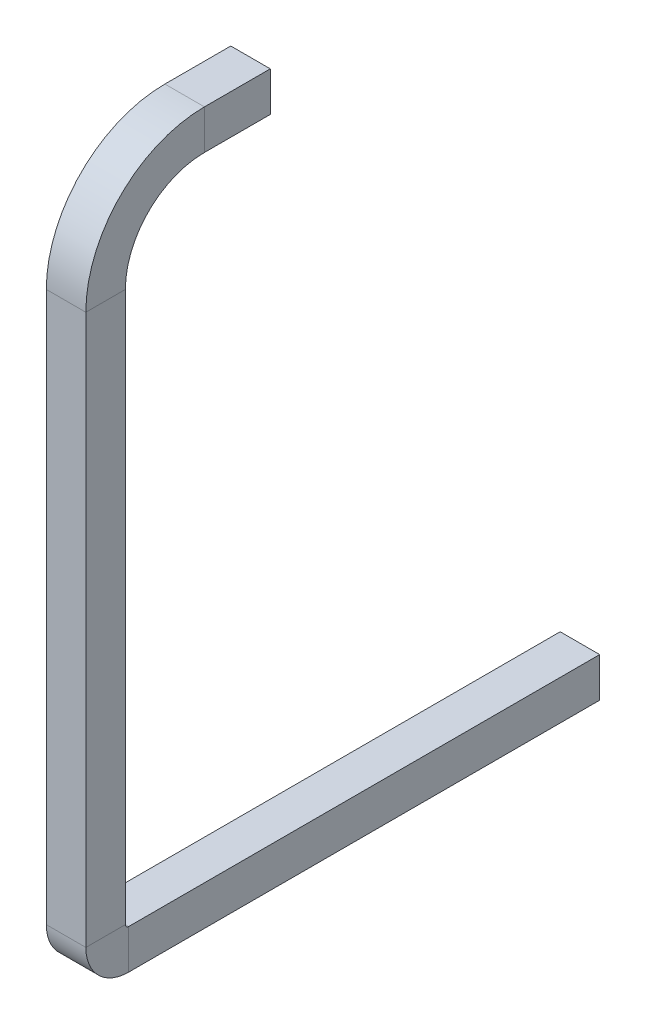
ISO-10303-21;
HEADER;
FILE_DESCRIPTION(('STEP AP214'),'2;1');
FILE_NAME('part.step','',(''),(''),'','','');
FILE_SCHEMA(('AUTOMOTIVE_DESIGN { 1 0 10303 214 1 1 1 1 }'));
ENDSEC;
DATA;
#1=APPLICATION_CONTEXT('core data for automotive mechanical design processes');
#2=APPLICATION_PROTOCOL_DEFINITION('international standard','automotive_design',2000,#1);
#3=PRODUCT_CONTEXT('',#1,'mechanical');
#4=PRODUCT('Part','Part','',(#3));
#5=PRODUCT_RELATED_PRODUCT_CATEGORY('part','',(#4));
#6=PRODUCT_DEFINITION_FORMATION('','',#4);
#7=PRODUCT_DEFINITION_CONTEXT('part definition',#1,'design');
#8=PRODUCT_DEFINITION('design','',#6,#7);
#9=PRODUCT_DEFINITION_SHAPE('','',#8);
#10=(LENGTH_UNIT() NAMED_UNIT(*) SI_UNIT(.MILLI.,.METRE.));
#11=(NAMED_UNIT(*) PLANE_ANGLE_UNIT() SI_UNIT($,.RADIAN.));
#12=(NAMED_UNIT(*) SI_UNIT($,.STERADIAN.) SOLID_ANGLE_UNIT());
#13=UNCERTAINTY_MEASURE_WITH_UNIT(LENGTH_MEASURE(1.E-05),#10,'distance_accuracy_value','');
#14=(GEOMETRIC_REPRESENTATION_CONTEXT(3) GLOBAL_UNCERTAINTY_ASSIGNED_CONTEXT((#13)) GLOBAL_UNIT_ASSIGNED_CONTEXT((#10,
#11,#12)) REPRESENTATION_CONTEXT('',''));
#15=CARTESIAN_POINT('',(0.,0.,0.));
#16=DIRECTION('',(0.,0.,1.));
#17=DIRECTION('',(1.,0.,0.));
#18=AXIS2_PLACEMENT_3D('',#15,#16,#17);
#19=CARTESIAN_POINT('',(0.3,-10.5,2.15));
#20=DIRECTION('',(0.,-1.,0.));
#21=DIRECTION('',(0.,0.,-1.));
#22=AXIS2_PLACEMENT_3D('',#19,#20,#21);
#23=PLANE('',#22);
#24=DIRECTION('',(-1.,0.,0.));
#25=VECTOR('',#24,1.);
#26=CARTESIAN_POINT('',(0.3,-10.5,2.15));
#27=LINE('',#26,#25);
#28=CARTESIAN_POINT('',(0.3,-10.5,2.15));
#29=VERTEX_POINT('',#28);
#30=CARTESIAN_POINT('',(-0.3,-10.5,2.15));
#31=VERTEX_POINT('',#30);
#32=EDGE_CURVE('E213',#29,#31,#27,.T.);
#33=ORIENTED_EDGE('',*,*,#32,.T.);
#34=DIRECTION('',(0.,0.,-1.));
#35=VECTOR('',#34,1.);
#36=CARTESIAN_POINT('',(-0.3,-10.5,2.15));
#37=LINE('',#36,#35);
#38=CARTESIAN_POINT('',(-0.3,-10.5,-5.));
#39=VERTEX_POINT('',#38);
#40=EDGE_CURVE('E40',#31,#39,#37,.T.);
#41=ORIENTED_EDGE('',*,*,#40,.T.);
#42=DIRECTION('',(-1.,0.,0.));
#43=VECTOR('',#42,1.);
#44=CARTESIAN_POINT('',(0.3,-10.5,-5.));
#45=LINE('',#44,#43);
#46=CARTESIAN_POINT('',(0.3,-10.5,-5.));
#47=VERTEX_POINT('',#46);
#48=EDGE_CURVE('E47',#47,#39,#45,.T.);
#49=ORIENTED_EDGE('',*,*,#48,.F.);
#50=DIRECTION('',(0.,0.,-1.));
#51=VECTOR('',#50,1.);
#52=CARTESIAN_POINT('',(0.3,-10.5,2.15));
#53=LINE('',#52,#51);
#54=EDGE_CURVE('E11',#29,#47,#53,.T.);
#55=ORIENTED_EDGE('',*,*,#54,.F.);
#56=EDGE_LOOP('',(#33,#41,#49,#55));
#57=FACE_BOUND('',#56,.T.);
#58=ADVANCED_FACE('F33',(#57),#23,.T.);
#59=CARTESIAN_POINT('',(-0.3,-10.5,2.15));
#60=DIRECTION('',(-1.,0.,0.));
#61=DIRECTION('',(0.,-1.,0.));
#62=AXIS2_PLACEMENT_3D('',#59,#60,#61);
#63=PLANE('',#62);
#64=DIRECTION('',(0.,1.,0.));
#65=VECTOR('',#64,1.);
#66=CARTESIAN_POINT('',(-0.3,-10.5,2.15));
#67=LINE('',#66,#65);
#68=CARTESIAN_POINT('',(-0.3,-9.89999999999999,2.15));
#69=VERTEX_POINT('',#68);
#70=EDGE_CURVE('E210',#31,#69,#67,.T.);
#71=ORIENTED_EDGE('',*,*,#70,.T.);
#72=DIRECTION('',(0.,0.,-1.));
#73=VECTOR('',#72,1.);
#74=CARTESIAN_POINT('',(-0.3,-9.89999999999999,2.15));
#75=LINE('',#74,#73);
#76=CARTESIAN_POINT('',(-0.3,-9.9,-5.));
#77=VERTEX_POINT('',#76);
#78=EDGE_CURVE('E238',#69,#77,#75,.T.);
#79=ORIENTED_EDGE('',*,*,#78,.T.);
#80=DIRECTION('',(0.,1.,0.));
#81=VECTOR('',#80,1.);
#82=CARTESIAN_POINT('',(-0.3,-10.5,-5.));
#83=LINE('',#82,#81);
#84=EDGE_CURVE('E55',#39,#77,#83,.T.);
#85=ORIENTED_EDGE('',*,*,#84,.F.);
#86=ORIENTED_EDGE('',*,*,#40,.F.);
#87=EDGE_LOOP('',(#71,#79,#85,#86));
#88=FACE_BOUND('',#87,.T.);
#89=ADVANCED_FACE('F241',(#88),#63,.T.);
#90=CARTESIAN_POINT('',(0.3,-9.89999999999999,2.15));
#91=DIRECTION('',(0.,1.,0.));
#92=DIRECTION('',(0.,0.,1.));
#93=AXIS2_PLACEMENT_3D('',#90,#91,#92);
#94=PLANE('',#93);
#95=DIRECTION('',(1.,0.,0.));
#96=VECTOR('',#95,1.);
#97=CARTESIAN_POINT('',(0.3,-9.89999999999999,2.15));
#98=LINE('',#97,#96);
#99=CARTESIAN_POINT('',(0.3,-9.89999999999999,2.15));
#100=VERTEX_POINT('',#99);
#101=EDGE_CURVE('E207',#69,#100,#98,.T.);
#102=ORIENTED_EDGE('',*,*,#101,.T.);
#103=DIRECTION('',(0.,0.,-1.));
#104=VECTOR('',#103,1.);
#105=CARTESIAN_POINT('',(0.3,-9.89999999999999,2.15));
#106=LINE('',#105,#104);
#107=CARTESIAN_POINT('',(0.3,-9.9,-5.));
#108=VERTEX_POINT('',#107);
#109=EDGE_CURVE('E235',#100,#108,#106,.T.);
#110=ORIENTED_EDGE('',*,*,#109,.T.);
#111=DIRECTION('',(1.,0.,0.));
#112=VECTOR('',#111,1.);
#113=CARTESIAN_POINT('',(0.3,-9.9,-5.));
#114=LINE('',#113,#112);
#115=EDGE_CURVE('E230',#77,#108,#114,.T.);
#116=ORIENTED_EDGE('',*,*,#115,.F.);
#117=ORIENTED_EDGE('',*,*,#78,.F.);
#118=EDGE_LOOP('',(#102,#110,#116,#117));
#119=FACE_BOUND('',#118,.T.);
#120=ADVANCED_FACE('F299',(#119),#94,.T.);
#121=CARTESIAN_POINT('',(0.3,-10.5,2.15));
#122=DIRECTION('',(1.,0.,0.));
#123=DIRECTION('',(0.,1.,0.));
#124=AXIS2_PLACEMENT_3D('',#121,#122,#123);
#125=PLANE('',#124);
#126=DIRECTION('',(0.,-1.,0.));
#127=VECTOR('',#126,1.);
#128=CARTESIAN_POINT('',(0.3,-10.5,2.15));
#129=LINE('',#128,#127);
#130=EDGE_CURVE('E204',#100,#29,#129,.T.);
#131=ORIENTED_EDGE('',*,*,#130,.T.);
#132=ORIENTED_EDGE('',*,*,#54,.T.);
#133=DIRECTION('',(0.,-1.,0.));
#134=VECTOR('',#133,1.);
#135=CARTESIAN_POINT('',(0.3,-10.5,-5.));
#136=LINE('',#135,#134);
#137=EDGE_CURVE('E228',#108,#47,#136,.T.);
#138=ORIENTED_EDGE('',*,*,#137,.F.);
#139=ORIENTED_EDGE('',*,*,#109,.F.);
#140=EDGE_LOOP('',(#131,#132,#138,#139));
#141=FACE_BOUND('',#140,.T.);
#142=ADVANCED_FACE('F303',(#141),#125,.T.);
#143=CARTESIAN_POINT('',(0.,-9.85,2.15));
#144=DIRECTION('',(1.,0.,0.));
#145=DIRECTION('',(0.,0.,-1.));
#146=AXIS2_PLACEMENT_3D('',#143,#144,#145);
#147=CYLINDRICAL_SURFACE('',#146,0.649999999999999);
#148=DIRECTION('',(-1.,0.,0.));
#149=VECTOR('',#148,1.);
#150=CARTESIAN_POINT('',(0.3,-9.85,2.8));
#151=LINE('',#150,#149);
#152=CARTESIAN_POINT('',(0.3,-9.85,2.8));
#153=VERTEX_POINT('',#152);
#154=CARTESIAN_POINT('',(-0.3,-9.85,2.8));
#155=VERTEX_POINT('',#154);
#156=EDGE_CURVE('E189',#153,#155,#151,.T.);
#157=ORIENTED_EDGE('',*,*,#156,.T.);
#158=CARTESIAN_POINT('',(-0.3,-9.85,2.15));
#159=DIRECTION('',(1.,0.,0.));
#160=DIRECTION('',(0.,0.,-1.));
#161=AXIS2_PLACEMENT_3D('',#158,#159,#160);
#162=CIRCLE('',#161,0.649999999999999);
#163=EDGE_CURVE('E222',#155,#31,#162,.T.);
#164=ORIENTED_EDGE('',*,*,#163,.T.);
#165=ORIENTED_EDGE('',*,*,#32,.F.);
#166=CARTESIAN_POINT('',(0.3,-9.85,2.15));
#167=DIRECTION('',(1.,0.,0.));
#168=DIRECTION('',(0.,0.,-1.));
#169=AXIS2_PLACEMENT_3D('',#166,#167,#168);
#170=CIRCLE('',#169,0.649999999999999);
#171=EDGE_CURVE('E225',#153,#29,#170,.T.);
#172=ORIENTED_EDGE('',*,*,#171,.F.);
#173=EDGE_LOOP('',(#157,#164,#165,#172));
#174=FACE_BOUND('',#173,.T.);
#175=ADVANCED_FACE('F308',(#174),#147,.T.);
#176=CARTESIAN_POINT('',(-0.3,-9.85,2.8));
#177=DIRECTION('',(-1.,0.,0.));
#178=DIRECTION('',(0.,0.,1.));
#179=AXIS2_PLACEMENT_3D('',#176,#177,#178);
#180=PLANE('',#179);
#181=DIRECTION('',(0.,0.,-1.));
#182=VECTOR('',#181,1.);
#183=CARTESIAN_POINT('',(-0.3,-9.85,2.8));
#184=LINE('',#183,#182);
#185=CARTESIAN_POINT('',(-0.3,-9.85,2.2));
#186=VERTEX_POINT('',#185);
#187=EDGE_CURVE('E186',#155,#186,#184,.T.);
#188=ORIENTED_EDGE('',*,*,#187,.T.);
#189=CARTESIAN_POINT('',(-0.3,-9.85,2.15));
#190=DIRECTION('',(1.,0.,0.));
#191=DIRECTION('',(0.,0.,-1.));
#192=AXIS2_PLACEMENT_3D('',#189,#190,#191);
#193=CIRCLE('',#192,0.0499999999999988);
#194=EDGE_CURVE('E219',#186,#69,#193,.T.);
#195=ORIENTED_EDGE('',*,*,#194,.T.);
#196=ORIENTED_EDGE('',*,*,#70,.F.);
#197=ORIENTED_EDGE('',*,*,#163,.F.);
#198=EDGE_LOOP('',(#188,#195,#196,#197));
#199=FACE_BOUND('',#198,.T.);
#200=ADVANCED_FACE('F248',(#199),#180,.T.);
#201=CARTESIAN_POINT('',(0.,-9.85,2.15));
#202=DIRECTION('',(1.,0.,0.));
#203=DIRECTION('',(0.,0.,-1.));
#204=AXIS2_PLACEMENT_3D('',#201,#202,#203);
#205=CYLINDRICAL_SURFACE('',#204,0.0499999999999988);
#206=DIRECTION('',(1.,0.,0.));
#207=VECTOR('',#206,1.);
#208=CARTESIAN_POINT('',(0.3,-9.85,2.2));
#209=LINE('',#208,#207);
#210=CARTESIAN_POINT('',(0.3,-9.85,2.2));
#211=VERTEX_POINT('',#210);
#212=EDGE_CURVE('E183',#186,#211,#209,.T.);
#213=ORIENTED_EDGE('',*,*,#212,.T.);
#214=CARTESIAN_POINT('',(0.3,-9.85,2.15));
#215=DIRECTION('',(1.,0.,0.));
#216=DIRECTION('',(0.,0.,-1.));
#217=AXIS2_PLACEMENT_3D('',#214,#215,#216);
#218=CIRCLE('',#217,0.0499999999999988);
#219=EDGE_CURVE('E216',#211,#100,#218,.T.);
#220=ORIENTED_EDGE('',*,*,#219,.T.);
#221=ORIENTED_EDGE('',*,*,#101,.F.);
#222=ORIENTED_EDGE('',*,*,#194,.F.);
#223=EDGE_LOOP('',(#213,#220,#221,#222));
#224=FACE_BOUND('',#223,.T.);
#225=ADVANCED_FACE('F245',(#224),#205,.F.);
#226=CARTESIAN_POINT('',(0.3,-9.85,2.8));
#227=DIRECTION('',(1.,0.,0.));
#228=DIRECTION('',(0.,0.,-1.));
#229=AXIS2_PLACEMENT_3D('',#226,#227,#228);
#230=PLANE('',#229);
#231=DIRECTION('',(0.,0.,1.));
#232=VECTOR('',#231,1.);
#233=CARTESIAN_POINT('',(0.3,-9.85,2.8));
#234=LINE('',#233,#232);
#235=EDGE_CURVE('E134',#211,#153,#234,.T.);
#236=ORIENTED_EDGE('',*,*,#235,.T.);
#237=ORIENTED_EDGE('',*,*,#171,.T.);
#238=ORIENTED_EDGE('',*,*,#130,.F.);
#239=ORIENTED_EDGE('',*,*,#219,.F.);
#240=EDGE_LOOP('',(#236,#237,#238,#239));
#241=FACE_BOUND('',#240,.T.);
#242=ADVANCED_FACE('F317',(#241),#230,.T.);
#243=CARTESIAN_POINT('',(0.3,-1.5,2.8));
#244=DIRECTION('',(0.,0.,1.));
#245=DIRECTION('',(1.,0.,0.));
#246=AXIS2_PLACEMENT_3D('',#243,#244,#245);
#247=PLANE('',#246);
#248=DIRECTION('',(-1.,0.,0.));
#249=VECTOR('',#248,1.);
#250=CARTESIAN_POINT('',(0.3,-1.5,2.8));
#251=LINE('',#250,#249);
#252=CARTESIAN_POINT('',(0.3,-1.5,2.8));
#253=VERTEX_POINT('',#252);
#254=CARTESIAN_POINT('',(-0.3,-1.5,2.8));
#255=VERTEX_POINT('',#254);
#256=EDGE_CURVE('E131',#253,#255,#251,.T.);
#257=ORIENTED_EDGE('',*,*,#256,.T.);
#258=DIRECTION('',(0.,-1.,0.));
#259=VECTOR('',#258,1.);
#260=CARTESIAN_POINT('',(-0.3,-1.5,2.8));
#261=LINE('',#260,#259);
#262=EDGE_CURVE('E198',#255,#155,#261,.T.);
#263=ORIENTED_EDGE('',*,*,#262,.T.);
#264=ORIENTED_EDGE('',*,*,#156,.F.);
#265=DIRECTION('',(0.,-1.,0.));
#266=VECTOR('',#265,1.);
#267=CARTESIAN_POINT('',(0.3,-1.5,2.8));
#268=LINE('',#267,#266);
#269=EDGE_CURVE('E201',#253,#153,#268,.T.);
#270=ORIENTED_EDGE('',*,*,#269,.F.);
#271=EDGE_LOOP('',(#257,#263,#264,#270));
#272=FACE_BOUND('',#271,.T.);
#273=ADVANCED_FACE('F320',(#272),#247,.T.);
#274=CARTESIAN_POINT('',(-0.3,-1.5,2.8));
#275=DIRECTION('',(-1.,0.,0.));
#276=DIRECTION('',(0.,0.,1.));
#277=AXIS2_PLACEMENT_3D('',#274,#275,#276);
#278=PLANE('',#277);
#279=DIRECTION('',(0.,0.,-1.));
#280=VECTOR('',#279,1.);
#281=CARTESIAN_POINT('',(-0.3,-1.5,2.8));
#282=LINE('',#281,#280);
#283=CARTESIAN_POINT('',(-0.3,-1.5,2.2));
#284=VERTEX_POINT('',#283);
#285=EDGE_CURVE('E172',#255,#284,#282,.T.);
#286=ORIENTED_EDGE('',*,*,#285,.T.);
#287=DIRECTION('',(0.,-1.,0.));
#288=VECTOR('',#287,1.);
#289=CARTESIAN_POINT('',(-0.3,-1.5,2.2));
#290=LINE('',#289,#288);
#291=EDGE_CURVE('E195',#284,#186,#290,.T.);
#292=ORIENTED_EDGE('',*,*,#291,.T.);
#293=ORIENTED_EDGE('',*,*,#187,.F.);
#294=ORIENTED_EDGE('',*,*,#262,.F.);
#295=EDGE_LOOP('',(#286,#292,#293,#294));
#296=FACE_BOUND('',#295,.T.);
#297=ADVANCED_FACE('F255',(#296),#278,.T.);
#298=CARTESIAN_POINT('',(0.3,-1.5,2.2));
#299=DIRECTION('',(0.,0.,-1.));
#300=DIRECTION('',(0.,1.,0.));
#301=AXIS2_PLACEMENT_3D('',#298,#299,#300);
#302=PLANE('',#301);
#303=DIRECTION('',(1.,0.,0.));
#304=VECTOR('',#303,1.);
#305=CARTESIAN_POINT('',(0.3,-1.5,2.2));
#306=LINE('',#305,#304);
#307=CARTESIAN_POINT('',(0.3,-1.5,2.2));
#308=VERTEX_POINT('',#307);
#309=EDGE_CURVE('E164',#284,#308,#306,.T.);
#310=ORIENTED_EDGE('',*,*,#309,.T.);
#311=DIRECTION('',(0.,-1.,0.));
#312=VECTOR('',#311,1.);
#313=CARTESIAN_POINT('',(0.3,-1.5,2.2));
#314=LINE('',#313,#312);
#315=EDGE_CURVE('E192',#308,#211,#314,.T.);
#316=ORIENTED_EDGE('',*,*,#315,.T.);
#317=ORIENTED_EDGE('',*,*,#212,.F.);
#318=ORIENTED_EDGE('',*,*,#291,.F.);
#319=EDGE_LOOP('',(#310,#316,#317,#318));
#320=FACE_BOUND('',#319,.T.);
#321=ADVANCED_FACE('F253',(#320),#302,.T.);
#322=CARTESIAN_POINT('',(0.3,-1.5,2.8));
#323=DIRECTION('',(1.,0.,0.));
#324=DIRECTION('',(0.,0.,-1.));
#325=AXIS2_PLACEMENT_3D('',#322,#323,#324);
#326=PLANE('',#325);
#327=DIRECTION('',(0.,0.,1.));
#328=VECTOR('',#327,1.);
#329=CARTESIAN_POINT('',(0.3,-1.5,2.8));
#330=LINE('',#329,#328);
#331=EDGE_CURVE('E161',#308,#253,#330,.T.);
#332=ORIENTED_EDGE('',*,*,#331,.T.);
#333=ORIENTED_EDGE('',*,*,#269,.T.);
#334=ORIENTED_EDGE('',*,*,#235,.F.);
#335=ORIENTED_EDGE('',*,*,#315,.F.);
#336=EDGE_LOOP('',(#332,#333,#334,#335));
#337=FACE_BOUND('',#336,.T.);
#338=ADVANCED_FACE('F329',(#337),#326,.T.);
#339=CARTESIAN_POINT('',(0.,-1.5,0.999999999999997));
#340=DIRECTION('',(1.,0.,0.));
#341=DIRECTION('',(0.,0.,-1.));
#342=AXIS2_PLACEMENT_3D('',#339,#340,#341);
#343=CYLINDRICAL_SURFACE('',#342,1.8);
#344=DIRECTION('',(-1.,0.,0.));
#345=VECTOR('',#344,1.);
#346=CARTESIAN_POINT('',(0.3,0.3,0.999999999999997));
#347=LINE('',#346,#345);
#348=CARTESIAN_POINT('',(0.3,0.3,0.999999999999997));
#349=VERTEX_POINT('',#348);
#350=CARTESIAN_POINT('',(-0.3,0.3,0.999999999999997));
#351=VERTEX_POINT('',#350);
#352=EDGE_CURVE('E128',#349,#351,#347,.T.);
#353=ORIENTED_EDGE('',*,*,#352,.T.);
#354=CARTESIAN_POINT('',(-0.3,-1.5,0.999999999999997));
#355=DIRECTION('',(1.,0.,0.));
#356=DIRECTION('',(0.,0.,-1.));
#357=AXIS2_PLACEMENT_3D('',#354,#355,#356);
#358=CIRCLE('',#357,1.8);
#359=EDGE_CURVE('E135',#351,#255,#358,.T.);
#360=ORIENTED_EDGE('',*,*,#359,.T.);
#361=ORIENTED_EDGE('',*,*,#256,.F.);
#362=CARTESIAN_POINT('',(0.3,-1.5,0.999999999999997));
#363=DIRECTION('',(1.,0.,0.));
#364=DIRECTION('',(0.,0.,-1.));
#365=AXIS2_PLACEMENT_3D('',#362,#363,#364);
#366=CIRCLE('',#365,1.8);
#367=EDGE_CURVE('E123',#349,#253,#366,.T.);
#368=ORIENTED_EDGE('',*,*,#367,.F.);
#369=EDGE_LOOP('',(#353,#360,#361,#368));
#370=FACE_BOUND('',#369,.T.);
#371=ADVANCED_FACE('F125',(#370),#343,.T.);
#372=CARTESIAN_POINT('',(-0.3,0.3,0.999999999999997));
#373=DIRECTION('',(-1.,0.,0.));
#374=DIRECTION('',(0.,0.,1.));
#375=AXIS2_PLACEMENT_3D('',#372,#373,#374);
#376=PLANE('',#375);
#377=DIRECTION('',(0.,-1.,0.));
#378=VECTOR('',#377,1.);
#379=CARTESIAN_POINT('',(-0.3,0.3,0.999999999999997));
#380=LINE('',#379,#378);
#381=CARTESIAN_POINT('',(-0.3,-0.3,0.999999999999997));
#382=VERTEX_POINT('',#381);
#383=EDGE_CURVE('E156',#351,#382,#380,.T.);
#384=ORIENTED_EDGE('',*,*,#383,.T.);
#385=CARTESIAN_POINT('',(-0.3,-1.5,0.999999999999997));
#386=DIRECTION('',(1.,0.,0.));
#387=DIRECTION('',(0.,0.,-1.));
#388=AXIS2_PLACEMENT_3D('',#385,#386,#387);
#389=CIRCLE('',#388,1.2);
#390=EDGE_CURVE('E177',#382,#284,#389,.T.);
#391=ORIENTED_EDGE('',*,*,#390,.T.);
#392=ORIENTED_EDGE('',*,*,#285,.F.);
#393=ORIENTED_EDGE('',*,*,#359,.F.);
#394=EDGE_LOOP('',(#384,#391,#392,#393));
#395=FACE_BOUND('',#394,.T.);
#396=ADVANCED_FACE('F262',(#395),#376,.T.);
#397=CARTESIAN_POINT('',(0.,-1.5,0.999999999999997));
#398=DIRECTION('',(1.,0.,0.));
#399=DIRECTION('',(0.,0.,-1.));
#400=AXIS2_PLACEMENT_3D('',#397,#398,#399);
#401=CYLINDRICAL_SURFACE('',#400,1.2);
#402=DIRECTION('',(1.,0.,0.));
#403=VECTOR('',#402,1.);
#404=CARTESIAN_POINT('',(0.3,-0.3,0.999999999999997));
#405=LINE('',#404,#403);
#406=CARTESIAN_POINT('',(0.3,-0.3,0.999999999999997));
#407=VERTEX_POINT('',#406);
#408=EDGE_CURVE('E265',#382,#407,#405,.T.);
#409=ORIENTED_EDGE('',*,*,#408,.T.);
#410=CARTESIAN_POINT('',(0.3,-1.5,0.999999999999997));
#411=DIRECTION('',(1.,0.,0.));
#412=DIRECTION('',(0.,0.,-1.));
#413=AXIS2_PLACEMENT_3D('',#410,#411,#412);
#414=CIRCLE('',#413,1.2);
#415=EDGE_CURVE('E141',#407,#308,#414,.T.);
#416=ORIENTED_EDGE('',*,*,#415,.T.);
#417=ORIENTED_EDGE('',*,*,#309,.F.);
#418=ORIENTED_EDGE('',*,*,#390,.F.);
#419=EDGE_LOOP('',(#409,#416,#417,#418));
#420=FACE_BOUND('',#419,.T.);
#421=ADVANCED_FACE('F260',(#420),#401,.F.);
#422=CARTESIAN_POINT('',(0.3,0.3,0.999999999999997));
#423=DIRECTION('',(1.,0.,0.));
#424=DIRECTION('',(0.,0.,-1.));
#425=AXIS2_PLACEMENT_3D('',#422,#423,#424);
#426=PLANE('',#425);
#427=DIRECTION('',(0.,1.,0.));
#428=VECTOR('',#427,1.);
#429=CARTESIAN_POINT('',(0.3,0.3,0.999999999999997));
#430=LINE('',#429,#428);
#431=EDGE_CURVE('E138',#407,#349,#430,.T.);
#432=ORIENTED_EDGE('',*,*,#431,.T.);
#433=ORIENTED_EDGE('',*,*,#367,.T.);
#434=ORIENTED_EDGE('',*,*,#331,.F.);
#435=ORIENTED_EDGE('',*,*,#415,.F.);
#436=EDGE_LOOP('',(#432,#433,#434,#435));
#437=FACE_BOUND('',#436,.T.);
#438=ADVANCED_FACE('F139',(#437),#426,.T.);
#439=CARTESIAN_POINT('',(0.3,0.3,0.999999999999997));
#440=DIRECTION('',(-1.,0.,0.));
#441=DIRECTION('',(0.,-1.,0.));
#442=AXIS2_PLACEMENT_3D('',#439,#440,#441);
#443=PLANE('',#442);
#444=DIRECTION('',(0.,1.,0.));
#445=VECTOR('',#444,1.);
#446=CARTESIAN_POINT('',(0.3,0.3,0.));
#447=LINE('',#446,#445);
#448=CARTESIAN_POINT('',(0.3,-0.3,0.));
#449=VERTEX_POINT('',#448);
#450=CARTESIAN_POINT('',(0.3,0.3,0.));
#451=VERTEX_POINT('',#450);
#452=EDGE_CURVE('E160',#449,#451,#447,.T.);
#453=ORIENTED_EDGE('',*,*,#452,.T.);
#454=DIRECTION('',(0.,0.,-1.));
#455=VECTOR('',#454,1.);
#456=CARTESIAN_POINT('',(0.3,0.3,0.999999999999997));
#457=LINE('',#456,#455);
#458=EDGE_CURVE('E151',#349,#451,#457,.T.);
#459=ORIENTED_EDGE('',*,*,#458,.F.);
#460=ORIENTED_EDGE('',*,*,#431,.F.);
#461=DIRECTION('',(0.,0.,-1.));
#462=VECTOR('',#461,1.);
#463=CARTESIAN_POINT('',(0.3,-0.3,0.999999999999997));
#464=LINE('',#463,#462);
#465=EDGE_CURVE('E274',#407,#449,#464,.T.);
#466=ORIENTED_EDGE('',*,*,#465,.T.);
#467=EDGE_LOOP('',(#453,#459,#460,#466));
#468=FACE_BOUND('',#467,.T.);
#469=ADVANCED_FACE('F158',(#468),#443,.F.);
#470=CARTESIAN_POINT('',(0.3,0.3,0.999999999999997));
#471=DIRECTION('',(0.,-1.,0.));
#472=DIRECTION('',(1.,0.,0.));
#473=AXIS2_PLACEMENT_3D('',#470,#471,#472);
#474=PLANE('',#473);
#475=DIRECTION('',(-1.,0.,0.));
#476=VECTOR('',#475,1.);
#477=CARTESIAN_POINT('',(0.3,0.3,0.));
#478=LINE('',#477,#476);
#479=CARTESIAN_POINT('',(-0.3,0.3,0.));
#480=VERTEX_POINT('',#479);
#481=EDGE_CURVE('E281',#451,#480,#478,.T.);
#482=ORIENTED_EDGE('',*,*,#481,.T.);
#483=DIRECTION('',(0.,0.,-1.));
#484=VECTOR('',#483,1.);
#485=CARTESIAN_POINT('',(-0.3,0.3,0.999999999999997));
#486=LINE('',#485,#484);
#487=EDGE_CURVE('E154',#351,#480,#486,.T.);
#488=ORIENTED_EDGE('',*,*,#487,.F.);
#489=ORIENTED_EDGE('',*,*,#352,.F.);
#490=ORIENTED_EDGE('',*,*,#458,.T.);
#491=EDGE_LOOP('',(#482,#488,#489,#490));
#492=FACE_BOUND('',#491,.T.);
#493=ADVANCED_FACE('F150',(#492),#474,.F.);
#494=CARTESIAN_POINT('',(-0.3,0.3,0.999999999999997));
#495=DIRECTION('',(1.,0.,0.));
#496=DIRECTION('',(0.,1.,0.));
#497=AXIS2_PLACEMENT_3D('',#494,#495,#496);
#498=PLANE('',#497);
#499=DIRECTION('',(0.,-1.,0.));
#500=VECTOR('',#499,1.);
#501=CARTESIAN_POINT('',(-0.3,0.3,0.));
#502=LINE('',#501,#500);
#503=CARTESIAN_POINT('',(-0.3,-0.3,0.));
#504=VERTEX_POINT('',#503);
#505=EDGE_CURVE('E271',#480,#504,#502,.T.);
#506=ORIENTED_EDGE('',*,*,#505,.T.);
#507=DIRECTION('',(0.,0.,-1.));
#508=VECTOR('',#507,1.);
#509=CARTESIAN_POINT('',(-0.3,-0.3,0.999999999999997));
#510=LINE('',#509,#508);
#511=EDGE_CURVE('E166',#382,#504,#510,.T.);
#512=ORIENTED_EDGE('',*,*,#511,.F.);
#513=ORIENTED_EDGE('',*,*,#383,.F.);
#514=ORIENTED_EDGE('',*,*,#487,.T.);
#515=EDGE_LOOP('',(#506,#512,#513,#514));
#516=FACE_BOUND('',#515,.T.);
#517=ADVANCED_FACE('F269',(#516),#498,.F.);
#518=CARTESIAN_POINT('',(0.3,-0.3,0.999999999999997));
#519=DIRECTION('',(0.,1.,0.));
#520=DIRECTION('',(-1.,0.,0.));
#521=AXIS2_PLACEMENT_3D('',#518,#519,#520);
#522=PLANE('',#521);
#523=DIRECTION('',(1.,0.,0.));
#524=VECTOR('',#523,1.);
#525=CARTESIAN_POINT('',(0.3,-0.3,0.));
#526=LINE('',#525,#524);
#527=EDGE_CURVE('E146',#504,#449,#526,.T.);
#528=ORIENTED_EDGE('',*,*,#527,.T.);
#529=ORIENTED_EDGE('',*,*,#465,.F.);
#530=ORIENTED_EDGE('',*,*,#408,.F.);
#531=ORIENTED_EDGE('',*,*,#511,.T.);
#532=EDGE_LOOP('',(#528,#529,#530,#531));
#533=FACE_BOUND('',#532,.T.);
#534=ADVANCED_FACE('F276',(#533),#522,.F.);
#535=CARTESIAN_POINT('',(0.,-10.2,-5.));
#536=DIRECTION('',(0.,0.,1.));
#537=DIRECTION('',(-1.,0.,0.));
#538=AXIS2_PLACEMENT_3D('',#535,#536,#537);
#539=PLANE('',#538);
#540=ORIENTED_EDGE('',*,*,#137,.T.);
#541=ORIENTED_EDGE('',*,*,#48,.T.);
#542=ORIENTED_EDGE('',*,*,#84,.T.);
#543=ORIENTED_EDGE('',*,*,#115,.T.);
#544=EDGE_LOOP('',(#540,#541,#542,#543));
#545=FACE_BOUND('',#544,.T.);
#546=ADVANCED_FACE('F287',(#545),#539,.F.);
#547=CARTESIAN_POINT('',(0.,0.,0.));
#548=DIRECTION('',(0.,0.,-1.));
#549=DIRECTION('',(-1.,0.,0.));
#550=AXIS2_PLACEMENT_3D('',#547,#548,#549);
#551=PLANE('',#550);
#552=ORIENTED_EDGE('',*,*,#452,.F.);
#553=ORIENTED_EDGE('',*,*,#527,.F.);
#554=ORIENTED_EDGE('',*,*,#505,.F.);
#555=ORIENTED_EDGE('',*,*,#481,.F.);
#556=EDGE_LOOP('',(#552,#553,#554,#555));
#557=FACE_BOUND('',#556,.T.);
#558=ADVANCED_FACE('F285',(#557),#551,.T.);
#559=CLOSED_SHELL('',(#58,#89,#120,#142,#175,#200,#225,#242,#273,#297,#321,#338,#371,#396,#421,
#438,#469,#493,#517,#534,#546,#558));
#560=MANIFOLD_SOLID_BREP('B2',#559);
#561=ADVANCED_BREP_SHAPE_REPRESENTATION('',(#18,#560),#14);
#562=SHAPE_DEFINITION_REPRESENTATION(#9,#561);
ENDSEC;
END-ISO-10303-21;
